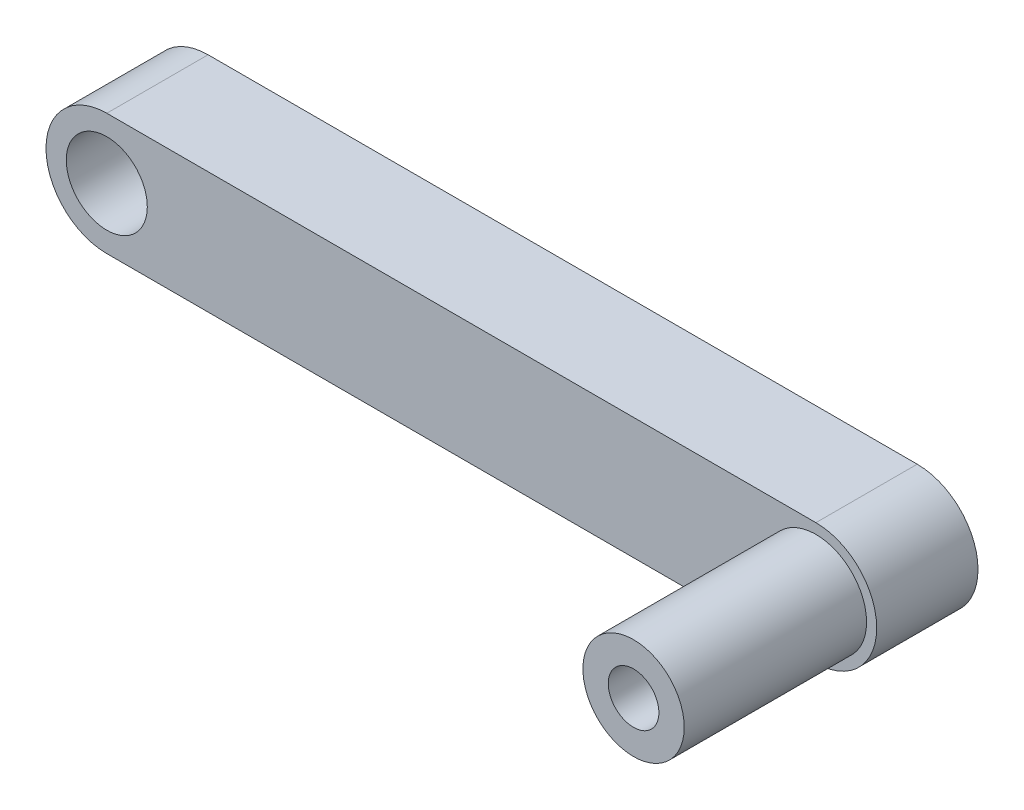
ISO-10303-21;
HEADER;
FILE_DESCRIPTION(('STEP AP214'),'2;1');
FILE_NAME('part.step','',(''),(''),'','','');
FILE_SCHEMA(('AUTOMOTIVE_DESIGN { 1 0 10303 214 1 1 1 1 }'));
ENDSEC;
DATA;
#1=APPLICATION_CONTEXT('core data for automotive mechanical design processes');
#2=APPLICATION_PROTOCOL_DEFINITION('international standard','automotive_design',2000,#1);
#3=PRODUCT_CONTEXT('',#1,'mechanical');
#4=PRODUCT('Part','Part','',(#3));
#5=PRODUCT_RELATED_PRODUCT_CATEGORY('part','',(#4));
#6=PRODUCT_DEFINITION_FORMATION('','',#4);
#7=PRODUCT_DEFINITION_CONTEXT('part definition',#1,'design');
#8=PRODUCT_DEFINITION('design','',#6,#7);
#9=PRODUCT_DEFINITION_SHAPE('','',#8);
#10=(LENGTH_UNIT() NAMED_UNIT(*) SI_UNIT(.MILLI.,.METRE.));
#11=(NAMED_UNIT(*) PLANE_ANGLE_UNIT() SI_UNIT($,.RADIAN.));
#12=(NAMED_UNIT(*) SI_UNIT($,.STERADIAN.) SOLID_ANGLE_UNIT());
#13=UNCERTAINTY_MEASURE_WITH_UNIT(LENGTH_MEASURE(1.E-05),#10,'distance_accuracy_value','');
#14=(GEOMETRIC_REPRESENTATION_CONTEXT(3) GLOBAL_UNCERTAINTY_ASSIGNED_CONTEXT((#13)) GLOBAL_UNIT_ASSIGNED_CONTEXT((#10,
#11,#12)) REPRESENTATION_CONTEXT('',''));
#15=CARTESIAN_POINT('',(0.,0.,0.));
#16=DIRECTION('',(0.,0.,1.));
#17=DIRECTION('',(1.,0.,0.));
#18=AXIS2_PLACEMENT_3D('',#15,#16,#17);
#19=CARTESIAN_POINT('',(60.2673648835116,0.,10.));
#20=DIRECTION('',(0.,0.,1.));
#21=DIRECTION('',(1.,0.,0.));
#22=AXIS2_PLACEMENT_3D('',#19,#20,#21);
#23=PLANE('',#22);
#24=CARTESIAN_POINT('',(60.2673648835116,0.,10.));
#25=DIRECTION('',(0.,0.,1.));
#26=DIRECTION('',(1.,0.,0.));
#27=AXIS2_PLACEMENT_3D('',#24,#25,#26);
#28=CIRCLE('',#27,5.);
#29=CARTESIAN_POINT('',(65.2673648835116,0.,10.));
#30=VERTEX_POINT('',#29);
#31=EDGE_CURVE('E145',#30,#30,#28,.T.);
#32=ORIENTED_EDGE('',*,*,#31,.F.);
#33=EDGE_LOOP('',(#32));
#34=FACE_BOUND('',#33,.T.);
#35=CARTESIAN_POINT('',(60.2673648835116,0.,10.));
#36=DIRECTION('',(0.,0.,1.));
#37=DIRECTION('',(1.,0.,0.));
#38=AXIS2_PLACEMENT_3D('',#35,#36,#37);
#39=CIRCLE('',#38,6.);
#40=CARTESIAN_POINT('',(60.2673648835116,-5.99999999999999,10.));
#41=VERTEX_POINT('',#40);
#42=CARTESIAN_POINT('',(60.2673648835116,6.00000000000001,10.));
#43=VERTEX_POINT('',#42);
#44=EDGE_CURVE('E93',#41,#43,#39,.T.);
#45=ORIENTED_EDGE('',*,*,#44,.T.);
#46=DIRECTION('',(-1.,0.,0.));
#47=VECTOR('',#46,1.);
#48=CARTESIAN_POINT('',(60.2673648835116,6.00000000000001,10.));
#49=LINE('',#48,#47);
#50=CARTESIAN_POINT('',(-9.73263511648842,6.00000000000001,10.));
#51=VERTEX_POINT('',#50);
#52=EDGE_CURVE('E88',#43,#51,#49,.T.);
#53=ORIENTED_EDGE('',*,*,#52,.T.);
#54=CARTESIAN_POINT('',(-9.73263511648842,0.,10.));
#55=DIRECTION('',(0.,0.,1.));
#56=DIRECTION('',(1.,0.,0.));
#57=AXIS2_PLACEMENT_3D('',#54,#55,#56);
#58=CIRCLE('',#57,6.);
#59=CARTESIAN_POINT('',(-9.73263511648842,-5.99999999999999,10.));
#60=VERTEX_POINT('',#59);
#61=EDGE_CURVE('E91',#51,#60,#58,.T.);
#62=ORIENTED_EDGE('',*,*,#61,.T.);
#63=DIRECTION('',(1.,0.,0.));
#64=VECTOR('',#63,1.);
#65=CARTESIAN_POINT('',(60.2673648835116,-5.99999999999999,10.));
#66=LINE('',#65,#64);
#67=EDGE_CURVE('E57',#60,#41,#66,.T.);
#68=ORIENTED_EDGE('',*,*,#67,.T.);
#69=EDGE_LOOP('',(#45,#53,#62,#68));
#70=FACE_BOUND('',#69,.T.);
#71=CARTESIAN_POINT('',(-9.73263511648842,0.,10.));
#72=DIRECTION('',(0.,0.,1.));
#73=DIRECTION('',(1.,0.,0.));
#74=AXIS2_PLACEMENT_3D('',#71,#72,#73);
#75=CIRCLE('',#74,4.);
#76=CARTESIAN_POINT('',(-5.73263511648842,0.,10.));
#77=VERTEX_POINT('',#76);
#78=EDGE_CURVE('E115',#77,#77,#75,.T.);
#79=ORIENTED_EDGE('',*,*,#78,.F.);
#80=EDGE_LOOP('',(#79));
#81=FACE_BOUND('',#80,.T.);
#82=ADVANCED_FACE('F39',(#34,#70,#81),#23,.T.);
#83=CARTESIAN_POINT('',(60.2673648835116,0.,0.));
#84=DIRECTION('',(0.,0.,1.));
#85=DIRECTION('',(1.,0.,0.));
#86=AXIS2_PLACEMENT_3D('',#83,#84,#85);
#87=PLANE('',#86);
#88=CARTESIAN_POINT('',(60.2673648835116,0.,0.));
#89=DIRECTION('',(0.,0.,1.));
#90=DIRECTION('',(1.,0.,0.));
#91=AXIS2_PLACEMENT_3D('',#88,#89,#90);
#92=CIRCLE('',#91,6.);
#93=CARTESIAN_POINT('',(60.2673648835116,-5.99999999999999,0.));
#94=VERTEX_POINT('',#93);
#95=CARTESIAN_POINT('',(60.2673648835116,6.00000000000001,0.));
#96=VERTEX_POINT('',#95);
#97=EDGE_CURVE('E111',#94,#96,#92,.T.);
#98=ORIENTED_EDGE('',*,*,#97,.F.);
#99=DIRECTION('',(1.,0.,0.));
#100=VECTOR('',#99,1.);
#101=CARTESIAN_POINT('',(60.2673648835116,-5.99999999999999,0.));
#102=LINE('',#101,#100);
#103=CARTESIAN_POINT('',(-9.73263511648842,-5.99999999999999,0.));
#104=VERTEX_POINT('',#103);
#105=EDGE_CURVE('E80',#104,#94,#102,.T.);
#106=ORIENTED_EDGE('',*,*,#105,.F.);
#107=CARTESIAN_POINT('',(-9.73263511648842,0.,0.));
#108=DIRECTION('',(0.,0.,1.));
#109=DIRECTION('',(1.,0.,0.));
#110=AXIS2_PLACEMENT_3D('',#107,#108,#109);
#111=CIRCLE('',#110,6.);
#112=CARTESIAN_POINT('',(-9.73263511648842,6.00000000000001,0.));
#113=VERTEX_POINT('',#112);
#114=EDGE_CURVE('E74',#113,#104,#111,.T.);
#115=ORIENTED_EDGE('',*,*,#114,.F.);
#116=DIRECTION('',(-1.,0.,0.));
#117=VECTOR('',#116,1.);
#118=CARTESIAN_POINT('',(60.2673648835116,6.00000000000001,0.));
#119=LINE('',#118,#117);
#120=EDGE_CURVE('E99',#96,#113,#119,.T.);
#121=ORIENTED_EDGE('',*,*,#120,.F.);
#122=EDGE_LOOP('',(#98,#106,#115,#121));
#123=FACE_BOUND('',#122,.T.);
#124=CARTESIAN_POINT('',(-9.73263511648842,0.,0.));
#125=DIRECTION('',(0.,0.,1.));
#126=DIRECTION('',(1.,0.,0.));
#127=AXIS2_PLACEMENT_3D('',#124,#125,#126);
#128=CIRCLE('',#127,4.);
#129=CARTESIAN_POINT('',(-5.73263511648842,0.,0.));
#130=VERTEX_POINT('',#129);
#131=EDGE_CURVE('E135',#130,#130,#128,.T.);
#132=ORIENTED_EDGE('',*,*,#131,.T.);
#133=EDGE_LOOP('',(#132));
#134=FACE_BOUND('',#133,.T.);
#135=ADVANCED_FACE('F129',(#123,#134),#87,.F.);
#136=CARTESIAN_POINT('',(60.2673648835116,0.,10.));
#137=DIRECTION('',(0.,0.,-1.));
#138=DIRECTION('',(-1.,0.,0.));
#139=AXIS2_PLACEMENT_3D('',#136,#137,#138);
#140=CYLINDRICAL_SURFACE('',#139,6.);
#141=ORIENTED_EDGE('',*,*,#97,.T.);
#142=DIRECTION('',(0.,0.,-1.));
#143=VECTOR('',#142,1.);
#144=CARTESIAN_POINT('',(60.2673648835116,6.00000000000001,10.));
#145=LINE('',#144,#143);
#146=EDGE_CURVE('E49',#43,#96,#145,.T.);
#147=ORIENTED_EDGE('',*,*,#146,.F.);
#148=ORIENTED_EDGE('',*,*,#44,.F.);
#149=DIRECTION('',(0.,0.,-1.));
#150=VECTOR('',#149,1.);
#151=CARTESIAN_POINT('',(60.2673648835116,-5.99999999999999,10.));
#152=LINE('',#151,#150);
#153=EDGE_CURVE('E107',#41,#94,#152,.T.);
#154=ORIENTED_EDGE('',*,*,#153,.T.);
#155=EDGE_LOOP('',(#141,#147,#148,#154));
#156=FACE_BOUND('',#155,.T.);
#157=ADVANCED_FACE('F41',(#156),#140,.T.);
#158=CARTESIAN_POINT('',(60.2673648835116,6.00000000000001,10.));
#159=DIRECTION('',(0.,-1.,0.));
#160=DIRECTION('',(0.,0.,-1.));
#161=AXIS2_PLACEMENT_3D('',#158,#159,#160);
#162=PLANE('',#161);
#163=ORIENTED_EDGE('',*,*,#120,.T.);
#164=DIRECTION('',(0.,0.,-1.));
#165=VECTOR('',#164,1.);
#166=CARTESIAN_POINT('',(-9.73263511648842,6.00000000000001,10.));
#167=LINE('',#166,#165);
#168=EDGE_CURVE('E97',#51,#113,#167,.T.);
#169=ORIENTED_EDGE('',*,*,#168,.F.);
#170=ORIENTED_EDGE('',*,*,#52,.F.);
#171=ORIENTED_EDGE('',*,*,#146,.T.);
#172=EDGE_LOOP('',(#163,#169,#170,#171));
#173=FACE_BOUND('',#172,.T.);
#174=ADVANCED_FACE('F98',(#173),#162,.F.);
#175=CARTESIAN_POINT('',(-9.73263511648842,0.,10.));
#176=DIRECTION('',(0.,0.,-1.));
#177=DIRECTION('',(-1.,0.,0.));
#178=AXIS2_PLACEMENT_3D('',#175,#176,#177);
#179=CYLINDRICAL_SURFACE('',#178,6.);
#180=ORIENTED_EDGE('',*,*,#114,.T.);
#181=DIRECTION('',(0.,0.,-1.));
#182=VECTOR('',#181,1.);
#183=CARTESIAN_POINT('',(-9.73263511648842,-5.99999999999999,10.));
#184=LINE('',#183,#182);
#185=EDGE_CURVE('E101',#60,#104,#184,.T.);
#186=ORIENTED_EDGE('',*,*,#185,.F.);
#187=ORIENTED_EDGE('',*,*,#61,.F.);
#188=ORIENTED_EDGE('',*,*,#168,.T.);
#189=EDGE_LOOP('',(#180,#186,#187,#188));
#190=FACE_BOUND('',#189,.T.);
#191=ADVANCED_FACE('F103',(#190),#179,.T.);
#192=CARTESIAN_POINT('',(60.2673648835116,-5.99999999999999,10.));
#193=DIRECTION('',(0.,1.,0.));
#194=DIRECTION('',(0.,0.,1.));
#195=AXIS2_PLACEMENT_3D('',#192,#193,#194);
#196=PLANE('',#195);
#197=ORIENTED_EDGE('',*,*,#105,.T.);
#198=ORIENTED_EDGE('',*,*,#153,.F.);
#199=ORIENTED_EDGE('',*,*,#67,.F.);
#200=ORIENTED_EDGE('',*,*,#185,.T.);
#201=EDGE_LOOP('',(#197,#198,#199,#200));
#202=FACE_BOUND('',#201,.T.);
#203=ADVANCED_FACE('F172',(#202),#196,.F.);
#204=CARTESIAN_POINT('',(-9.73263511648842,0.,10.));
#205=DIRECTION('',(0.,0.,-1.));
#206=DIRECTION('',(-1.,0.,0.));
#207=AXIS2_PLACEMENT_3D('',#204,#205,#206);
#208=CYLINDRICAL_SURFACE('',#207,4.);
#209=ORIENTED_EDGE('',*,*,#78,.T.);
#210=EDGE_LOOP('',(#209));
#211=FACE_BOUND('',#210,.T.);
#212=ORIENTED_EDGE('',*,*,#131,.F.);
#213=EDGE_LOOP('',(#212));
#214=FACE_BOUND('',#213,.T.);
#215=ADVANCED_FACE('F163',(#211,#214),#208,.F.);
#216=CARTESIAN_POINT('',(60.2673648835116,0.,28.));
#217=DIRECTION('',(0.,0.,1.));
#218=DIRECTION('',(1.,0.,0.));
#219=AXIS2_PLACEMENT_3D('',#216,#217,#218);
#220=PLANE('',#219);
#221=CARTESIAN_POINT('',(60.2673648835116,0.,28.));
#222=DIRECTION('',(0.,0.,1.));
#223=DIRECTION('',(1.,0.,0.));
#224=AXIS2_PLACEMENT_3D('',#221,#222,#223);
#225=CIRCLE('',#224,5.);
#226=CARTESIAN_POINT('',(65.2673648835116,0.,28.));
#227=VERTEX_POINT('',#226);
#228=EDGE_CURVE('E138',#227,#227,#225,.T.);
#229=ORIENTED_EDGE('',*,*,#228,.T.);
#230=EDGE_LOOP('',(#229));
#231=FACE_BOUND('',#230,.T.);
#232=CARTESIAN_POINT('',(60.2673648835116,0.,28.));
#233=DIRECTION('',(0.,0.,1.));
#234=DIRECTION('',(1.,0.,0.));
#235=AXIS2_PLACEMENT_3D('',#232,#233,#234);
#236=CIRCLE('',#235,2.5);
#237=CARTESIAN_POINT('',(62.7673648835116,0.,28.));
#238=VERTEX_POINT('',#237);
#239=EDGE_CURVE('E151',#238,#238,#236,.T.);
#240=ORIENTED_EDGE('',*,*,#239,.F.);
#241=EDGE_LOOP('',(#240));
#242=FACE_BOUND('',#241,.T.);
#243=ADVANCED_FACE('F160',(#231,#242),#220,.T.);
#244=CARTESIAN_POINT('',(60.2673648835116,0.,28.));
#245=DIRECTION('',(0.,0.,-1.));
#246=DIRECTION('',(-1.,0.,0.));
#247=AXIS2_PLACEMENT_3D('',#244,#245,#246);
#248=CYLINDRICAL_SURFACE('',#247,5.);
#249=ORIENTED_EDGE('',*,*,#228,.F.);
#250=EDGE_LOOP('',(#249));
#251=FACE_BOUND('',#250,.T.);
#252=ORIENTED_EDGE('',*,*,#31,.T.);
#253=EDGE_LOOP('',(#252));
#254=FACE_BOUND('',#253,.T.);
#255=ADVANCED_FACE('F162',(#251,#254),#248,.T.);
#256=CARTESIAN_POINT('',(60.2673648835116,0.,28.));
#257=DIRECTION('',(0.,0.,-1.));
#258=DIRECTION('',(-1.,0.,0.));
#259=AXIS2_PLACEMENT_3D('',#256,#257,#258);
#260=CYLINDRICAL_SURFACE('',#259,2.5);
#261=ORIENTED_EDGE('',*,*,#239,.T.);
#262=EDGE_LOOP('',(#261));
#263=FACE_BOUND('',#262,.T.);
#264=CARTESIAN_POINT('',(60.2673648835116,0.,10.));
#265=DIRECTION('',(0.,0.,1.));
#266=DIRECTION('',(1.,0.,0.));
#267=AXIS2_PLACEMENT_3D('',#264,#265,#266);
#268=CIRCLE('',#267,2.5);
#269=CARTESIAN_POINT('',(62.7673648835116,0.,10.));
#270=VERTEX_POINT('',#269);
#271=EDGE_CURVE('E11',#270,#270,#268,.F.);
#272=ORIENTED_EDGE('',*,*,#271,.T.);
#273=EDGE_LOOP('',(#272));
#274=FACE_BOUND('',#273,.T.);
#275=ADVANCED_FACE('F157',(#263,#274),#260,.F.);
#276=ORIENTED_EDGE('',*,*,#271,.F.);
#277=EDGE_LOOP('',(#276));
#278=FACE_BOUND('',#277,.T.);
#279=ADVANCED_FACE('F179',(#278),#23,.T.);
#280=CLOSED_SHELL('',(#82,#135,#157,#174,#191,#203,#215,#243,#255,#275,#279));
#281=MANIFOLD_SOLID_BREP('B2',#280);
#282=ADVANCED_BREP_SHAPE_REPRESENTATION('',(#18,#281),#14);
#283=SHAPE_DEFINITION_REPRESENTATION(#9,#282);
ENDSEC;
END-ISO-10303-21;
